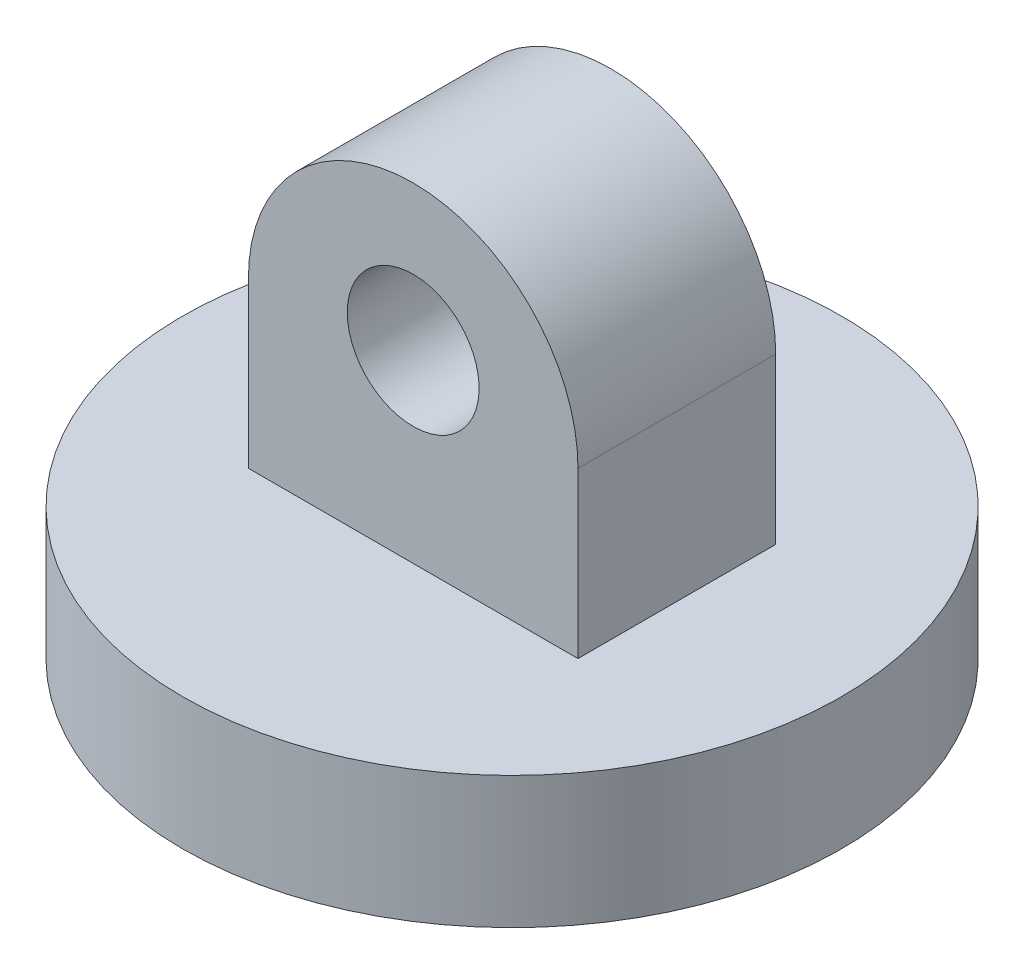
ISO-10303-21;
HEADER;
FILE_DESCRIPTION(('STEP AP214'),'2;1');
FILE_NAME('part.step','',(''),(''),'','','');
FILE_SCHEMA(('AUTOMOTIVE_DESIGN { 1 0 10303 214 1 1 1 1 }'));
ENDSEC;
DATA;
#1=APPLICATION_CONTEXT('core data for automotive mechanical design processes');
#2=APPLICATION_PROTOCOL_DEFINITION('international standard','automotive_design',2000,#1);
#3=PRODUCT_CONTEXT('',#1,'mechanical');
#4=PRODUCT('Part','Part','',(#3));
#5=PRODUCT_RELATED_PRODUCT_CATEGORY('part','',(#4));
#6=PRODUCT_DEFINITION_FORMATION('','',#4);
#7=PRODUCT_DEFINITION_CONTEXT('part definition',#1,'design');
#8=PRODUCT_DEFINITION('design','',#6,#7);
#9=PRODUCT_DEFINITION_SHAPE('','',#8);
#10=(LENGTH_UNIT() NAMED_UNIT(*) SI_UNIT(.MILLI.,.METRE.));
#11=(NAMED_UNIT(*) PLANE_ANGLE_UNIT() SI_UNIT($,.RADIAN.));
#12=(NAMED_UNIT(*) SI_UNIT($,.STERADIAN.) SOLID_ANGLE_UNIT());
#13=UNCERTAINTY_MEASURE_WITH_UNIT(LENGTH_MEASURE(1.E-05),#10,'distance_accuracy_value','');
#14=(GEOMETRIC_REPRESENTATION_CONTEXT(3) GLOBAL_UNCERTAINTY_ASSIGNED_CONTEXT((#13)) GLOBAL_UNIT_ASSIGNED_CONTEXT((#10,
#11,#12)) REPRESENTATION_CONTEXT('',''));
#15=CARTESIAN_POINT('',(0.,0.,0.));
#16=DIRECTION('',(0.,0.,1.));
#17=DIRECTION('',(1.,0.,0.));
#18=AXIS2_PLACEMENT_3D('',#15,#16,#17);
#19=CARTESIAN_POINT('',(0.,45.,15.));
#20=DIRECTION('',(0.,0.,1.));
#21=DIRECTION('',(1.,0.,0.));
#22=AXIS2_PLACEMENT_3D('',#19,#20,#21);
#23=CYLINDRICAL_SURFACE('',#22,25.);
#24=DIRECTION('',(0.,0.,-1.));
#25=VECTOR('',#24,1.);
#26=CARTESIAN_POINT('',(-25.,45.,15.));
#27=LINE('',#26,#25);
#28=CARTESIAN_POINT('',(-25.,45.,15.));
#29=VERTEX_POINT('',#28);
#30=CARTESIAN_POINT('',(-25.,45.,-15.));
#31=VERTEX_POINT('',#30);
#32=EDGE_CURVE('E113',#29,#31,#27,.T.);
#33=ORIENTED_EDGE('',*,*,#32,.F.);
#34=CARTESIAN_POINT('',(0.,45.,15.));
#35=DIRECTION('',(0.,0.,-1.));
#36=DIRECTION('',(-1.,0.,0.));
#37=AXIS2_PLACEMENT_3D('',#34,#35,#36);
#38=CIRCLE('',#37,25.);
#39=CARTESIAN_POINT('',(25.,45.,15.));
#40=VERTEX_POINT('',#39);
#41=EDGE_CURVE('E44',#40,#29,#38,.F.);
#42=ORIENTED_EDGE('',*,*,#41,.F.);
#43=DIRECTION('',(0.,0.,-1.));
#44=VECTOR('',#43,1.);
#45=CARTESIAN_POINT('',(25.,45.,15.));
#46=LINE('',#45,#44);
#47=CARTESIAN_POINT('',(25.,45.,-15.));
#48=VERTEX_POINT('',#47);
#49=EDGE_CURVE('E79',#48,#40,#46,.F.);
#50=ORIENTED_EDGE('',*,*,#49,.F.);
#51=CARTESIAN_POINT('',(0.,45.,-15.));
#52=DIRECTION('',(0.,0.,1.));
#53=DIRECTION('',(1.,0.,0.));
#54=AXIS2_PLACEMENT_3D('',#51,#52,#53);
#55=CIRCLE('',#54,25.);
#56=EDGE_CURVE('E11',#31,#48,#55,.F.);
#57=ORIENTED_EDGE('',*,*,#56,.F.);
#58=EDGE_LOOP('',(#33,#42,#50,#57));
#59=FACE_BOUND('',#58,.T.);
#60=ADVANCED_FACE('F36',(#59),#23,.T.);
#61=CARTESIAN_POINT('',(0.,20.,0.));
#62=DIRECTION('',(0.,-1.,0.));
#63=DIRECTION('',(0.,0.,-1.));
#64=AXIS2_PLACEMENT_3D('',#61,#62,#63);
#65=CYLINDRICAL_SURFACE('',#64,50.);
#66=CARTESIAN_POINT('',(0.,20.,0.));
#67=DIRECTION('',(0.,1.,0.));
#68=DIRECTION('',(0.,0.,1.));
#69=AXIS2_PLACEMENT_3D('',#66,#67,#68);
#70=CIRCLE('',#69,50.);
#71=CARTESIAN_POINT('',(0.,20.,50.));
#72=VERTEX_POINT('',#71);
#73=EDGE_CURVE('E110',#72,#72,#70,.T.);
#74=ORIENTED_EDGE('',*,*,#73,.F.);
#75=EDGE_LOOP('',(#74));
#76=FACE_BOUND('',#75,.T.);
#77=CARTESIAN_POINT('',(0.,0.,0.));
#78=DIRECTION('',(0.,1.,0.));
#79=DIRECTION('',(0.,0.,1.));
#80=AXIS2_PLACEMENT_3D('',#77,#78,#79);
#81=CIRCLE('',#80,50.);
#82=CARTESIAN_POINT('',(0.,0.,50.));
#83=VERTEX_POINT('',#82);
#84=EDGE_CURVE('E109',#83,#83,#81,.T.);
#85=ORIENTED_EDGE('',*,*,#84,.T.);
#86=EDGE_LOOP('',(#85));
#87=FACE_BOUND('',#86,.T.);
#88=ADVANCED_FACE('F134',(#76,#87),#65,.T.);
#89=CARTESIAN_POINT('',(0.,20.,0.));
#90=DIRECTION('',(0.,1.,0.));
#91=DIRECTION('',(0.,0.,1.));
#92=AXIS2_PLACEMENT_3D('',#89,#90,#91);
#93=PLANE('',#92);
#94=DIRECTION('',(0.,0.,1.));
#95=VECTOR('',#94,1.);
#96=CARTESIAN_POINT('',(-25.,20.,-15.));
#97=LINE('',#96,#95);
#98=CARTESIAN_POINT('',(-25.,20.,-15.));
#99=VERTEX_POINT('',#98);
#100=CARTESIAN_POINT('',(-25.,20.,15.));
#101=VERTEX_POINT('',#100);
#102=EDGE_CURVE('E98',#99,#101,#97,.T.);
#103=ORIENTED_EDGE('',*,*,#102,.F.);
#104=DIRECTION('',(-1.,0.,0.));
#105=VECTOR('',#104,1.);
#106=CARTESIAN_POINT('',(-25.,20.,-15.));
#107=LINE('',#106,#105);
#108=CARTESIAN_POINT('',(25.,20.,-15.));
#109=VERTEX_POINT('',#108);
#110=EDGE_CURVE('E94',#109,#99,#107,.T.);
#111=ORIENTED_EDGE('',*,*,#110,.F.);
#112=DIRECTION('',(0.,0.,-1.));
#113=VECTOR('',#112,1.);
#114=CARTESIAN_POINT('',(25.,20.,-15.));
#115=LINE('',#114,#113);
#116=CARTESIAN_POINT('',(25.,20.,15.));
#117=VERTEX_POINT('',#116);
#118=EDGE_CURVE('E78',#117,#109,#115,.T.);
#119=ORIENTED_EDGE('',*,*,#118,.F.);
#120=DIRECTION('',(1.,0.,0.));
#121=VECTOR('',#120,1.);
#122=CARTESIAN_POINT('',(-25.,20.,15.));
#123=LINE('',#122,#121);
#124=EDGE_CURVE('E91',#101,#117,#123,.T.);
#125=ORIENTED_EDGE('',*,*,#124,.F.);
#126=EDGE_LOOP('',(#103,#111,#119,#125));
#127=FACE_BOUND('',#126,.T.);
#128=ORIENTED_EDGE('',*,*,#73,.T.);
#129=EDGE_LOOP('',(#128));
#130=FACE_BOUND('',#129,.T.);
#131=ADVANCED_FACE('F89',(#127,#130),#93,.T.);
#132=CARTESIAN_POINT('',(0.,0.,0.));
#133=DIRECTION('',(0.,1.,0.));
#134=DIRECTION('',(0.,0.,1.));
#135=AXIS2_PLACEMENT_3D('',#132,#133,#134);
#136=PLANE('',#135);
#137=ORIENTED_EDGE('',*,*,#84,.F.);
#138=EDGE_LOOP('',(#137));
#139=FACE_BOUND('',#138,.T.);
#140=ADVANCED_FACE('F142',(#139),#136,.F.);
#141=CARTESIAN_POINT('',(-25.,70.,-15.));
#142=DIRECTION('',(1.,0.,0.));
#143=DIRECTION('',(0.,0.,-1.));
#144=AXIS2_PLACEMENT_3D('',#141,#142,#143);
#145=PLANE('',#144);
#146=DIRECTION('',(0.,-1.,0.));
#147=VECTOR('',#146,1.);
#148=CARTESIAN_POINT('',(-25.,70.,15.));
#149=LINE('',#148,#147);
#150=EDGE_CURVE('E82',#29,#101,#149,.T.);
#151=ORIENTED_EDGE('',*,*,#150,.F.);
#152=ORIENTED_EDGE('',*,*,#32,.T.);
#153=DIRECTION('',(0.,-1.,0.));
#154=VECTOR('',#153,1.);
#155=CARTESIAN_POINT('',(-25.,70.,-15.));
#156=LINE('',#155,#154);
#157=EDGE_CURVE('E105',#31,#99,#156,.T.);
#158=ORIENTED_EDGE('',*,*,#157,.T.);
#159=ORIENTED_EDGE('',*,*,#102,.T.);
#160=EDGE_LOOP('',(#151,#152,#158,#159));
#161=FACE_BOUND('',#160,.T.);
#162=ADVANCED_FACE('F119',(#161),#145,.F.);
#163=CARTESIAN_POINT('',(-25.,70.,15.));
#164=DIRECTION('',(0.,0.,-1.));
#165=DIRECTION('',(-1.,0.,0.));
#166=AXIS2_PLACEMENT_3D('',#163,#164,#165);
#167=PLANE('',#166);
#168=CARTESIAN_POINT('',(0.,48.,15.));
#169=DIRECTION('',(0.,0.,-1.));
#170=DIRECTION('',(-1.,0.,0.));
#171=AXIS2_PLACEMENT_3D('',#168,#169,#170);
#172=CIRCLE('',#171,10.);
#173=CARTESIAN_POINT('',(-10.,48.,15.));
#174=VERTEX_POINT('',#173);
#175=EDGE_CURVE('E100',#174,#174,#172,.T.);
#176=ORIENTED_EDGE('',*,*,#175,.T.);
#177=EDGE_LOOP('',(#176));
#178=FACE_BOUND('',#177,.T.);
#179=DIRECTION('',(0.,-1.,0.));
#180=VECTOR('',#179,1.);
#181=CARTESIAN_POINT('',(25.,70.,15.));
#182=LINE('',#181,#180);
#183=EDGE_CURVE('E74',#40,#117,#182,.T.);
#184=ORIENTED_EDGE('',*,*,#183,.F.);
#185=ORIENTED_EDGE('',*,*,#41,.T.);
#186=ORIENTED_EDGE('',*,*,#150,.T.);
#187=ORIENTED_EDGE('',*,*,#124,.T.);
#188=EDGE_LOOP('',(#184,#185,#186,#187));
#189=FACE_BOUND('',#188,.T.);
#190=ADVANCED_FACE('F96',(#178,#189),#167,.F.);
#191=CARTESIAN_POINT('',(25.,70.,-15.));
#192=DIRECTION('',(-1.,0.,0.));
#193=DIRECTION('',(0.,0.,1.));
#194=AXIS2_PLACEMENT_3D('',#191,#192,#193);
#195=PLANE('',#194);
#196=DIRECTION('',(0.,-1.,0.));
#197=VECTOR('',#196,1.);
#198=CARTESIAN_POINT('',(25.,70.,-15.));
#199=LINE('',#198,#197);
#200=EDGE_CURVE('E83',#48,#109,#199,.T.);
#201=ORIENTED_EDGE('',*,*,#200,.F.);
#202=ORIENTED_EDGE('',*,*,#49,.T.);
#203=ORIENTED_EDGE('',*,*,#183,.T.);
#204=ORIENTED_EDGE('',*,*,#118,.T.);
#205=EDGE_LOOP('',(#201,#202,#203,#204));
#206=FACE_BOUND('',#205,.T.);
#207=ADVANCED_FACE('F77',(#206),#195,.F.);
#208=CARTESIAN_POINT('',(-25.,70.,-15.));
#209=DIRECTION('',(0.,0.,1.));
#210=DIRECTION('',(1.,0.,0.));
#211=AXIS2_PLACEMENT_3D('',#208,#209,#210);
#212=PLANE('',#211);
#213=CARTESIAN_POINT('',(0.,48.,-15.));
#214=DIRECTION('',(0.,0.,-1.));
#215=DIRECTION('',(-1.,0.,0.));
#216=AXIS2_PLACEMENT_3D('',#213,#214,#215);
#217=CIRCLE('',#216,10.);
#218=CARTESIAN_POINT('',(-10.,48.,-15.));
#219=VERTEX_POINT('',#218);
#220=EDGE_CURVE('E158',#219,#219,#217,.T.);
#221=ORIENTED_EDGE('',*,*,#220,.F.);
#222=EDGE_LOOP('',(#221));
#223=FACE_BOUND('',#222,.T.);
#224=ORIENTED_EDGE('',*,*,#157,.F.);
#225=ORIENTED_EDGE('',*,*,#56,.T.);
#226=ORIENTED_EDGE('',*,*,#200,.T.);
#227=ORIENTED_EDGE('',*,*,#110,.T.);
#228=EDGE_LOOP('',(#224,#225,#226,#227));
#229=FACE_BOUND('',#228,.T.);
#230=ADVANCED_FACE('F120',(#223,#229),#212,.F.);
#231=CARTESIAN_POINT('',(0.,48.,15.));
#232=DIRECTION('',(0.,0.,-1.));
#233=DIRECTION('',(-1.,0.,0.));
#234=AXIS2_PLACEMENT_3D('',#231,#232,#233);
#235=CYLINDRICAL_SURFACE('',#234,10.);
#236=ORIENTED_EDGE('',*,*,#175,.F.);
#237=EDGE_LOOP('',(#236));
#238=FACE_BOUND('',#237,.T.);
#239=ORIENTED_EDGE('',*,*,#220,.T.);
#240=EDGE_LOOP('',(#239));
#241=FACE_BOUND('',#240,.T.);
#242=ADVANCED_FACE('F122',(#238,#241),#235,.F.);
#243=CLOSED_SHELL('',(#60,#88,#131,#140,#162,#190,#207,#230,#242));
#244=MANIFOLD_SOLID_BREP('B2',#243);
#245=ADVANCED_BREP_SHAPE_REPRESENTATION('',(#18,#244),#14);
#246=SHAPE_DEFINITION_REPRESENTATION(#9,#245);
ENDSEC;
END-ISO-10303-21;
